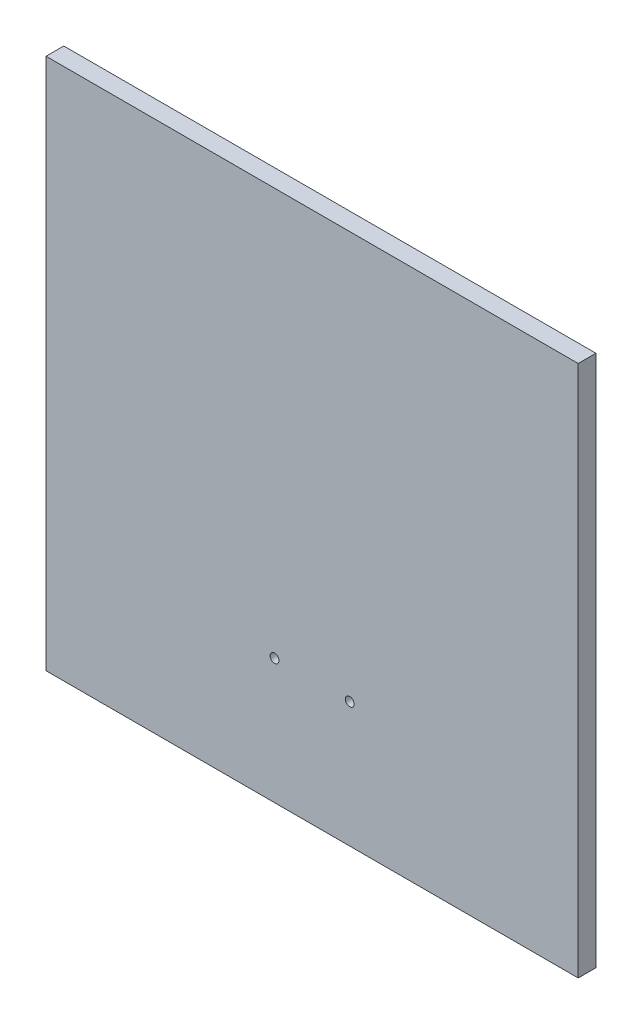
ISO-10303-21;
HEADER;
FILE_DESCRIPTION(('STEP AP214'),'2;1');
FILE_NAME('part.step','',(''),(''),'','','');
FILE_SCHEMA(('AUTOMOTIVE_DESIGN { 1 0 10303 214 1 1 1 1 }'));
ENDSEC;
DATA;
#1=APPLICATION_CONTEXT('core data for automotive mechanical design processes');
#2=APPLICATION_PROTOCOL_DEFINITION('international standard','automotive_design',2000,#1);
#3=PRODUCT_CONTEXT('',#1,'mechanical');
#4=PRODUCT('Part','Part','',(#3));
#5=PRODUCT_RELATED_PRODUCT_CATEGORY('part','',(#4));
#6=PRODUCT_DEFINITION_FORMATION('','',#4);
#7=PRODUCT_DEFINITION_CONTEXT('part definition',#1,'design');
#8=PRODUCT_DEFINITION('design','',#6,#7);
#9=PRODUCT_DEFINITION_SHAPE('','',#8);
#10=(LENGTH_UNIT() NAMED_UNIT(*) SI_UNIT(.MILLI.,.METRE.));
#11=(NAMED_UNIT(*) PLANE_ANGLE_UNIT() SI_UNIT($,.RADIAN.));
#12=(NAMED_UNIT(*) SI_UNIT($,.STERADIAN.) SOLID_ANGLE_UNIT());
#13=UNCERTAINTY_MEASURE_WITH_UNIT(LENGTH_MEASURE(1.E-05),#10,'distance_accuracy_value','');
#14=(GEOMETRIC_REPRESENTATION_CONTEXT(3) GLOBAL_UNCERTAINTY_ASSIGNED_CONTEXT((#13)) GLOBAL_UNIT_ASSIGNED_CONTEXT((#10,
#11,#12)) REPRESENTATION_CONTEXT('',''));
#15=CARTESIAN_POINT('',(0.,0.,0.));
#16=DIRECTION('',(0.,0.,1.));
#17=DIRECTION('',(1.,0.,0.));
#18=AXIS2_PLACEMENT_3D('',#15,#16,#17);
#19=CARTESIAN_POINT('',(0.,0.,10.));
#20=DIRECTION('',(0.,0.,1.));
#21=DIRECTION('',(1.,0.,0.));
#22=AXIS2_PLACEMENT_3D('',#19,#20,#21);
#23=PLANE('',#22);
#24=CARTESIAN_POINT('',(21.2302788844621,-144.01720331579,10.));
#25=DIRECTION('',(0.,0.,1.));
#26=DIRECTION('',(1.,0.,0.));
#27=AXIS2_PLACEMENT_3D('',#24,#25,#26);
#28=CIRCLE('',#27,2.50000000000001);
#29=CARTESIAN_POINT('',(23.7302788844621,-144.01720331579,10.));
#30=VERTEX_POINT('',#29);
#31=EDGE_CURVE('E100',#30,#30,#28,.T.);
#32=ORIENTED_EDGE('',*,*,#31,.F.);
#33=EDGE_LOOP('',(#32));
#34=FACE_BOUND('',#33,.T.);
#35=DIRECTION('',(0.,-1.,0.));
#36=VECTOR('',#35,1.);
#37=CARTESIAN_POINT('',(-107.569721115538,85.4581673306773,10.));
#38=LINE('',#37,#36);
#39=CARTESIAN_POINT('',(-107.569721115538,85.4581673306773,10.));
#40=VERTEX_POINT('',#39);
#41=CARTESIAN_POINT('',(-107.569721115538,-214.541832669323,10.));
#42=VERTEX_POINT('',#41);
#43=EDGE_CURVE('E85',#40,#42,#38,.T.);
#44=ORIENTED_EDGE('',*,*,#43,.T.);
#45=DIRECTION('',(1.,0.,0.));
#46=VECTOR('',#45,1.);
#47=CARTESIAN_POINT('',(-107.569721115538,-214.541832669323,10.));
#48=LINE('',#47,#46);
#49=CARTESIAN_POINT('',(192.430278884462,-214.541832669323,10.));
#50=VERTEX_POINT('',#49);
#51=EDGE_CURVE('E80',#42,#50,#48,.T.);
#52=ORIENTED_EDGE('',*,*,#51,.T.);
#53=DIRECTION('',(0.,1.,0.));
#54=VECTOR('',#53,1.);
#55=CARTESIAN_POINT('',(192.430278884462,85.4581673306773,10.));
#56=LINE('',#55,#54);
#57=CARTESIAN_POINT('',(192.430278884462,85.4581673306773,10.));
#58=VERTEX_POINT('',#57);
#59=EDGE_CURVE('E83',#50,#58,#56,.T.);
#60=ORIENTED_EDGE('',*,*,#59,.T.);
#61=DIRECTION('',(-1.,0.,0.));
#62=VECTOR('',#61,1.);
#63=CARTESIAN_POINT('',(-107.569721115538,85.4581673306773,10.));
#64=LINE('',#63,#62);
#65=EDGE_CURVE('E50',#58,#40,#64,.T.);
#66=ORIENTED_EDGE('',*,*,#65,.T.);
#67=EDGE_LOOP('',(#44,#52,#60,#66));
#68=FACE_BOUND('',#67,.T.);
#69=CARTESIAN_POINT('',(63.6302788844621,-144.01720331579,10.));
#70=DIRECTION('',(0.,0.,1.));
#71=DIRECTION('',(-1.,0.,0.));
#72=AXIS2_PLACEMENT_3D('',#69,#70,#71);
#73=CIRCLE('',#72,2.5);
#74=CARTESIAN_POINT('',(61.1302788844621,-144.01720331579,10.));
#75=VERTEX_POINT('',#74);
#76=EDGE_CURVE('E115',#75,#75,#73,.T.);
#77=ORIENTED_EDGE('',*,*,#76,.F.);
#78=EDGE_LOOP('',(#77));
#79=FACE_BOUND('',#78,.T.);
#80=ADVANCED_FACE('F33',(#34,#68,#79),#23,.T.);
#81=CARTESIAN_POINT('',(0.,0.,0.));
#82=DIRECTION('',(0.,0.,1.));
#83=DIRECTION('',(1.,0.,0.));
#84=AXIS2_PLACEMENT_3D('',#81,#82,#83);
#85=PLANE('',#84);
#86=DIRECTION('',(0.,-1.,0.));
#87=VECTOR('',#86,1.);
#88=CARTESIAN_POINT('',(-107.569721115538,85.4581673306773,0.));
#89=LINE('',#88,#87);
#90=CARTESIAN_POINT('',(-107.569721115538,85.4581673306773,0.));
#91=VERTEX_POINT('',#90);
#92=CARTESIAN_POINT('',(-107.569721115538,-214.541832669323,0.));
#93=VERTEX_POINT('',#92);
#94=EDGE_CURVE('E97',#91,#93,#89,.T.);
#95=ORIENTED_EDGE('',*,*,#94,.F.);
#96=DIRECTION('',(-1.,0.,0.));
#97=VECTOR('',#96,1.);
#98=CARTESIAN_POINT('',(-107.569721115538,85.4581673306773,0.));
#99=LINE('',#98,#97);
#100=CARTESIAN_POINT('',(192.430278884462,85.4581673306773,0.));
#101=VERTEX_POINT('',#100);
#102=EDGE_CURVE('E73',#101,#91,#99,.T.);
#103=ORIENTED_EDGE('',*,*,#102,.F.);
#104=DIRECTION('',(0.,1.,0.));
#105=VECTOR('',#104,1.);
#106=CARTESIAN_POINT('',(192.430278884462,85.4581673306773,0.));
#107=LINE('',#106,#105);
#108=CARTESIAN_POINT('',(192.430278884462,-214.541832669323,0.));
#109=VERTEX_POINT('',#108);
#110=EDGE_CURVE('E67',#109,#101,#107,.T.);
#111=ORIENTED_EDGE('',*,*,#110,.F.);
#112=DIRECTION('',(1.,0.,0.));
#113=VECTOR('',#112,1.);
#114=CARTESIAN_POINT('',(-107.569721115538,-214.541832669323,0.));
#115=LINE('',#114,#113);
#116=EDGE_CURVE('E89',#93,#109,#115,.T.);
#117=ORIENTED_EDGE('',*,*,#116,.F.);
#118=EDGE_LOOP('',(#95,#103,#111,#117));
#119=FACE_BOUND('',#118,.T.);
#120=CARTESIAN_POINT('',(21.2302788844621,-144.01720331579,0.));
#121=DIRECTION('',(0.,0.,1.));
#122=DIRECTION('',(1.,0.,0.));
#123=AXIS2_PLACEMENT_3D('',#120,#121,#122);
#124=CIRCLE('',#123,2.50000000000001);
#125=CARTESIAN_POINT('',(23.7302788844621,-144.01720331579,0.));
#126=VERTEX_POINT('',#125);
#127=EDGE_CURVE('E112',#126,#126,#124,.T.);
#128=ORIENTED_EDGE('',*,*,#127,.T.);
#129=EDGE_LOOP('',(#128));
#130=FACE_BOUND('',#129,.T.);
#131=CARTESIAN_POINT('',(63.6302788844621,-144.01720331579,0.));
#132=DIRECTION('',(0.,0.,1.));
#133=DIRECTION('',(-1.,0.,0.));
#134=AXIS2_PLACEMENT_3D('',#131,#132,#133);
#135=CIRCLE('',#134,2.5);
#136=CARTESIAN_POINT('',(61.1302788844621,-144.01720331579,0.));
#137=VERTEX_POINT('',#136);
#138=EDGE_CURVE('E118',#137,#137,#135,.T.);
#139=ORIENTED_EDGE('',*,*,#138,.T.);
#140=EDGE_LOOP('',(#139));
#141=FACE_BOUND('',#140,.T.);
#142=ADVANCED_FACE('F108',(#119,#130,#141),#85,.F.);
#143=CARTESIAN_POINT('',(-107.569721115538,85.4581673306773,10.));
#144=DIRECTION('',(1.,0.,0.));
#145=DIRECTION('',(0.,1.,0.));
#146=AXIS2_PLACEMENT_3D('',#143,#144,#145);
#147=PLANE('',#146);
#148=ORIENTED_EDGE('',*,*,#94,.T.);
#149=DIRECTION('',(0.,0.,-1.));
#150=VECTOR('',#149,1.);
#151=CARTESIAN_POINT('',(-107.569721115538,-214.541832669323,10.));
#152=LINE('',#151,#150);
#153=EDGE_CURVE('E11',#42,#93,#152,.T.);
#154=ORIENTED_EDGE('',*,*,#153,.F.);
#155=ORIENTED_EDGE('',*,*,#43,.F.);
#156=DIRECTION('',(0.,0.,-1.));
#157=VECTOR('',#156,1.);
#158=CARTESIAN_POINT('',(-107.569721115538,85.4581673306773,10.));
#159=LINE('',#158,#157);
#160=EDGE_CURVE('E93',#40,#91,#159,.T.);
#161=ORIENTED_EDGE('',*,*,#160,.T.);
#162=EDGE_LOOP('',(#148,#154,#155,#161));
#163=FACE_BOUND('',#162,.T.);
#164=ADVANCED_FACE('F35',(#163),#147,.F.);
#165=CARTESIAN_POINT('',(-107.569721115538,-214.541832669323,10.));
#166=DIRECTION('',(0.,1.,0.));
#167=DIRECTION('',(0.,0.,1.));
#168=AXIS2_PLACEMENT_3D('',#165,#166,#167);
#169=PLANE('',#168);
#170=ORIENTED_EDGE('',*,*,#116,.T.);
#171=DIRECTION('',(0.,0.,-1.));
#172=VECTOR('',#171,1.);
#173=CARTESIAN_POINT('',(192.430278884462,-214.541832669323,10.));
#174=LINE('',#173,#172);
#175=EDGE_CURVE('E42',#50,#109,#174,.T.);
#176=ORIENTED_EDGE('',*,*,#175,.F.);
#177=ORIENTED_EDGE('',*,*,#51,.F.);
#178=ORIENTED_EDGE('',*,*,#153,.T.);
#179=EDGE_LOOP('',(#170,#176,#177,#178));
#180=FACE_BOUND('',#179,.T.);
#181=ADVANCED_FACE('F88',(#180),#169,.F.);
#182=CARTESIAN_POINT('',(192.430278884462,85.4581673306773,10.));
#183=DIRECTION('',(-1.,0.,0.));
#184=DIRECTION('',(0.,-1.,0.));
#185=AXIS2_PLACEMENT_3D('',#182,#183,#184);
#186=PLANE('',#185);
#187=ORIENTED_EDGE('',*,*,#110,.T.);
#188=DIRECTION('',(0.,0.,-1.));
#189=VECTOR('',#188,1.);
#190=CARTESIAN_POINT('',(192.430278884462,85.4581673306773,10.));
#191=LINE('',#190,#189);
#192=EDGE_CURVE('E90',#58,#101,#191,.T.);
#193=ORIENTED_EDGE('',*,*,#192,.F.);
#194=ORIENTED_EDGE('',*,*,#59,.F.);
#195=ORIENTED_EDGE('',*,*,#175,.T.);
#196=EDGE_LOOP('',(#187,#193,#194,#195));
#197=FACE_BOUND('',#196,.T.);
#198=ADVANCED_FACE('F91',(#197),#186,.F.);
#199=CARTESIAN_POINT('',(-107.569721115538,85.4581673306773,10.));
#200=DIRECTION('',(0.,-1.,0.));
#201=DIRECTION('',(0.,0.,-1.));
#202=AXIS2_PLACEMENT_3D('',#199,#200,#201);
#203=PLANE('',#202);
#204=ORIENTED_EDGE('',*,*,#102,.T.);
#205=ORIENTED_EDGE('',*,*,#160,.F.);
#206=ORIENTED_EDGE('',*,*,#65,.F.);
#207=ORIENTED_EDGE('',*,*,#192,.T.);
#208=EDGE_LOOP('',(#204,#205,#206,#207));
#209=FACE_BOUND('',#208,.T.);
#210=ADVANCED_FACE('F105',(#209),#203,.F.);
#211=CARTESIAN_POINT('',(21.2302788844621,-144.01720331579,10.));
#212=DIRECTION('',(0.,0.,-1.));
#213=DIRECTION('',(-1.,0.,0.));
#214=AXIS2_PLACEMENT_3D('',#211,#212,#213);
#215=CYLINDRICAL_SURFACE('',#214,2.50000000000001);
#216=ORIENTED_EDGE('',*,*,#31,.T.);
#217=EDGE_LOOP('',(#216));
#218=FACE_BOUND('',#217,.T.);
#219=ORIENTED_EDGE('',*,*,#127,.F.);
#220=EDGE_LOOP('',(#219));
#221=FACE_BOUND('',#220,.T.);
#222=ADVANCED_FACE('F135',(#218,#221),#215,.F.);
#223=CARTESIAN_POINT('',(63.6302788844621,-144.01720331579,10.));
#224=DIRECTION('',(0.,0.,-1.));
#225=DIRECTION('',(-1.,0.,0.));
#226=AXIS2_PLACEMENT_3D('',#223,#224,#225);
#227=CYLINDRICAL_SURFACE('',#226,2.5);
#228=ORIENTED_EDGE('',*,*,#76,.T.);
#229=EDGE_LOOP('',(#228));
#230=FACE_BOUND('',#229,.T.);
#231=ORIENTED_EDGE('',*,*,#138,.F.);
#232=EDGE_LOOP('',(#231));
#233=FACE_BOUND('',#232,.T.);
#234=ADVANCED_FACE('F124',(#230,#233),#227,.F.);
#235=CLOSED_SHELL('',(#80,#142,#164,#181,#198,#210,#222,#234));
#236=MANIFOLD_SOLID_BREP('B2',#235);
#237=ADVANCED_BREP_SHAPE_REPRESENTATION('',(#18,#236),#14);
#238=SHAPE_DEFINITION_REPRESENTATION(#9,#237);
ENDSEC;
END-ISO-10303-21;
